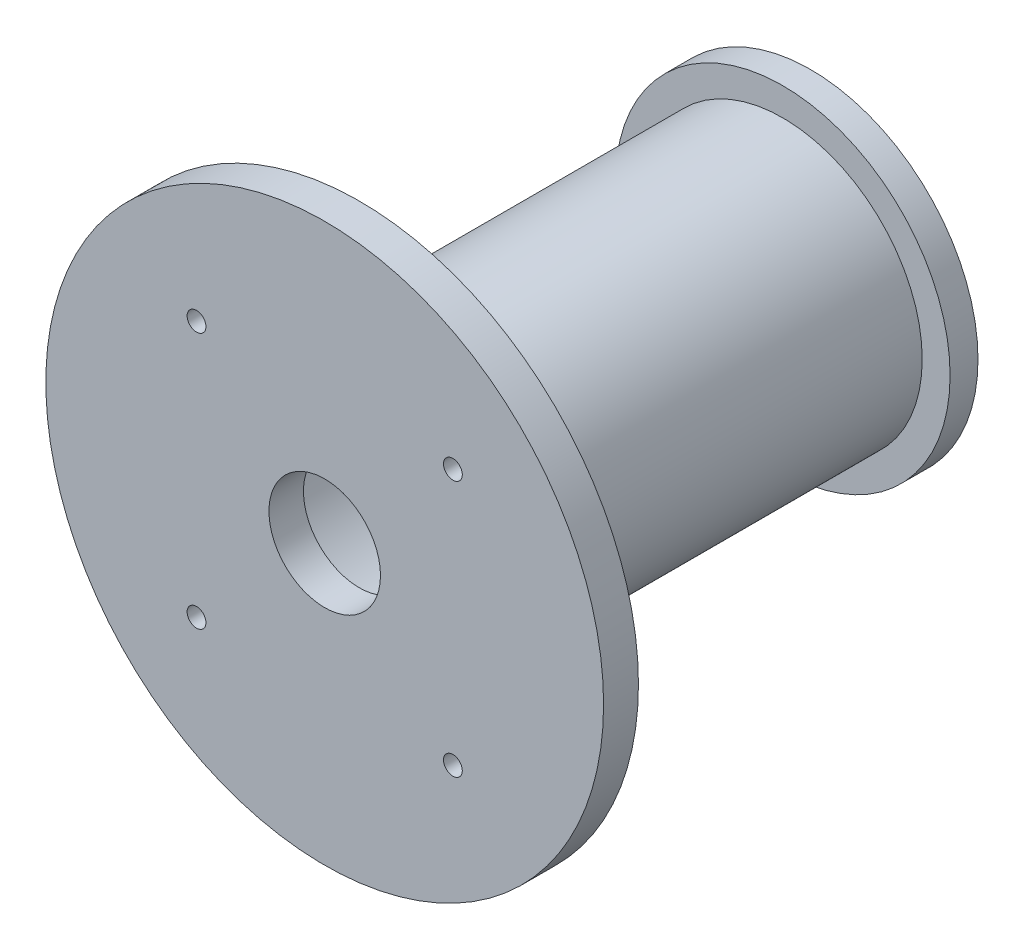
ISO-10303-21;
HEADER;
FILE_DESCRIPTION(('STEP AP214'),'2;1');
FILE_NAME('part.step','',(''),(''),'','','');
FILE_SCHEMA(('AUTOMOTIVE_DESIGN { 1 0 10303 214 1 1 1 1 }'));
ENDSEC;
DATA;
#1=APPLICATION_CONTEXT('core data for automotive mechanical design processes');
#2=APPLICATION_PROTOCOL_DEFINITION('international standard','automotive_design',2000,#1);
#3=PRODUCT_CONTEXT('',#1,'mechanical');
#4=PRODUCT('Part','Part','',(#3));
#5=PRODUCT_RELATED_PRODUCT_CATEGORY('part','',(#4));
#6=PRODUCT_DEFINITION_FORMATION('','',#4);
#7=PRODUCT_DEFINITION_CONTEXT('part definition',#1,'design');
#8=PRODUCT_DEFINITION('design','',#6,#7);
#9=PRODUCT_DEFINITION_SHAPE('','',#8);
#10=(LENGTH_UNIT() NAMED_UNIT(*) SI_UNIT(.MILLI.,.METRE.));
#11=(NAMED_UNIT(*) PLANE_ANGLE_UNIT() SI_UNIT($,.RADIAN.));
#12=(NAMED_UNIT(*) SI_UNIT($,.STERADIAN.) SOLID_ANGLE_UNIT());
#13=UNCERTAINTY_MEASURE_WITH_UNIT(LENGTH_MEASURE(1.E-05),#10,'distance_accuracy_value','');
#14=(GEOMETRIC_REPRESENTATION_CONTEXT(3) GLOBAL_UNCERTAINTY_ASSIGNED_CONTEXT((#13)) GLOBAL_UNIT_ASSIGNED_CONTEXT((#10,
#11,#12)) REPRESENTATION_CONTEXT('',''));
#15=CARTESIAN_POINT('',(0.,0.,0.));
#16=DIRECTION('',(0.,0.,1.));
#17=DIRECTION('',(1.,0.,0.));
#18=AXIS2_PLACEMENT_3D('',#15,#16,#17);
#19=CARTESIAN_POINT('',(120.,0.,131.7));
#20=DIRECTION('',(0.,0.,1.));
#21=DIRECTION('',(1.,0.,0.));
#22=AXIS2_PLACEMENT_3D('',#19,#20,#21);
#23=PLANE('',#22);
#24=CARTESIAN_POINT('',(138.38477631085,18.38477631085,131.7));
#25=DIRECTION('',(0.,0.,1.));
#26=DIRECTION('',(1.,0.,0.));
#27=AXIS2_PLACEMENT_3D('',#24,#25,#26);
#28=CIRCLE('',#27,1.35);
#29=CARTESIAN_POINT('',(139.73477631085,18.38477631085,131.7));
#30=VERTEX_POINT('',#29);
#31=EDGE_CURVE('E251',#30,#30,#28,.T.);
#32=ORIENTED_EDGE('',*,*,#31,.F.);
#33=EDGE_LOOP('',(#32));
#34=FACE_BOUND('',#33,.T.);
#35=CARTESIAN_POINT('',(101.61522368915,18.38477631085,131.7));
#36=DIRECTION('',(0.,0.,1.));
#37=DIRECTION('',(1.,0.,0.));
#38=AXIS2_PLACEMENT_3D('',#35,#36,#37);
#39=CIRCLE('',#38,1.35);
#40=CARTESIAN_POINT('',(102.96522368915,18.38477631085,131.7));
#41=VERTEX_POINT('',#40);
#42=EDGE_CURVE('E275',#41,#41,#39,.T.);
#43=ORIENTED_EDGE('',*,*,#42,.F.);
#44=EDGE_LOOP('',(#43));
#45=FACE_BOUND('',#44,.T.);
#46=CARTESIAN_POINT('',(120.,0.,131.7));
#47=DIRECTION('',(0.,0.,1.));
#48=DIRECTION('',(1.,0.,0.));
#49=AXIS2_PLACEMENT_3D('',#46,#47,#48);
#50=CIRCLE('',#49,8.);
#51=CARTESIAN_POINT('',(128.,0.,131.7));
#52=VERTEX_POINT('',#51);
#53=EDGE_CURVE('E9',#52,#52,#50,.T.);
#54=ORIENTED_EDGE('',*,*,#53,.F.);
#55=EDGE_LOOP('',(#54));
#56=FACE_BOUND('',#55,.T.);
#57=CARTESIAN_POINT('',(138.38477631085,-18.38477631085,131.7));
#58=DIRECTION('',(0.,0.,1.));
#59=DIRECTION('',(1.,0.,0.));
#60=AXIS2_PLACEMENT_3D('',#57,#58,#59);
#61=CIRCLE('',#60,1.35);
#62=CARTESIAN_POINT('',(139.73477631085,-18.38477631085,131.7));
#63=VERTEX_POINT('',#62);
#64=EDGE_CURVE('E276',#63,#63,#61,.T.);
#65=ORIENTED_EDGE('',*,*,#64,.F.);
#66=EDGE_LOOP('',(#65));
#67=FACE_BOUND('',#66,.T.);
#68=CARTESIAN_POINT('',(101.61522368915,-18.38477631085,131.7));
#69=DIRECTION('',(0.,0.,1.));
#70=DIRECTION('',(1.,0.,0.));
#71=AXIS2_PLACEMENT_3D('',#68,#69,#70);
#72=CIRCLE('',#71,1.35);
#73=CARTESIAN_POINT('',(102.96522368915,-18.38477631085,131.7));
#74=VERTEX_POINT('',#73);
#75=EDGE_CURVE('E249',#74,#74,#72,.T.);
#76=ORIENTED_EDGE('',*,*,#75,.F.);
#77=EDGE_LOOP('',(#76));
#78=FACE_BOUND('',#77,.T.);
#79=CARTESIAN_POINT('',(120.,0.,131.7));
#80=DIRECTION('',(0.,0.,1.));
#81=DIRECTION('',(1.,0.,0.));
#82=AXIS2_PLACEMENT_3D('',#79,#80,#81);
#83=CIRCLE('',#82,40.);
#84=CARTESIAN_POINT('',(160.,0.,131.7));
#85=VERTEX_POINT('',#84);
#86=EDGE_CURVE('E309',#85,#85,#83,.T.);
#87=ORIENTED_EDGE('',*,*,#86,.T.);
#88=EDGE_LOOP('',(#87));
#89=FACE_BOUND('',#88,.T.);
#90=ADVANCED_FACE('F14',(#34,#45,#56,#67,#78,#89),#23,.T.);
#91=CARTESIAN_POINT('',(120.,0.,126.6));
#92=DIRECTION('',(0.,0.,1.));
#93=DIRECTION('',(1.,0.,0.));
#94=AXIS2_PLACEMENT_3D('',#91,#92,#93);
#95=CYLINDRICAL_SURFACE('',#94,8.);
#96=DIRECTION('',(0.,0.,1.));
#97=VECTOR('',#96,1.);
#98=CARTESIAN_POINT('',(128.,0.,126.6));
#99=LINE('',#98,#97);
#100=CARTESIAN_POINT('',(128.,0.,126.75));
#101=VERTEX_POINT('',#100);
#102=EDGE_CURVE('E25',#101,#52,#99,.T.);
#103=ORIENTED_EDGE('',*,*,#102,.F.);
#104=CARTESIAN_POINT('',(120.,0.,126.75));
#105=DIRECTION('',(0.,0.,1.));
#106=DIRECTION('',(1.,0.,0.));
#107=AXIS2_PLACEMENT_3D('',#104,#105,#106);
#108=CIRCLE('',#107,8.);
#109=EDGE_CURVE('E314',#101,#101,#108,.T.);
#110=ORIENTED_EDGE('',*,*,#109,.F.);
#111=ORIENTED_EDGE('',*,*,#102,.T.);
#112=ORIENTED_EDGE('',*,*,#53,.T.);
#113=EDGE_LOOP('',(#103,#110,#111,#112));
#114=FACE_BOUND('',#113,.T.);
#115=ADVANCED_FACE('F537',(#114),#95,.F.);
#116=CARTESIAN_POINT('',(138.38477631085,18.38477631085,126.6));
#117=DIRECTION('',(0.,0.,1.));
#118=DIRECTION('',(1.,0.,0.));
#119=AXIS2_PLACEMENT_3D('',#116,#117,#118);
#120=CYLINDRICAL_SURFACE('',#119,1.35);
#121=DIRECTION('',(0.,0.,1.));
#122=VECTOR('',#121,1.);
#123=CARTESIAN_POINT('',(139.73477631085,18.38477631085,126.6));
#124=LINE('',#123,#122);
#125=CARTESIAN_POINT('',(139.73477631085,18.38477631085,126.7));
#126=VERTEX_POINT('',#125);
#127=EDGE_CURVE('E252',#126,#30,#124,.T.);
#128=ORIENTED_EDGE('',*,*,#127,.F.);
#129=CARTESIAN_POINT('',(138.38477631085,18.38477631085,126.7));
#130=DIRECTION('',(0.,0.,1.));
#131=DIRECTION('',(1.,0.,0.));
#132=AXIS2_PLACEMENT_3D('',#129,#130,#131);
#133=CIRCLE('',#132,1.35);
#134=EDGE_CURVE('E295',#126,#126,#133,.T.);
#135=ORIENTED_EDGE('',*,*,#134,.F.);
#136=ORIENTED_EDGE('',*,*,#127,.T.);
#137=ORIENTED_EDGE('',*,*,#31,.T.);
#138=EDGE_LOOP('',(#128,#135,#136,#137));
#139=FACE_BOUND('',#138,.T.);
#140=ADVANCED_FACE('F543',(#139),#120,.F.);
#141=CARTESIAN_POINT('',(101.61522368915,18.38477631085,126.6));
#142=DIRECTION('',(0.,0.,1.));
#143=DIRECTION('',(1.,0.,0.));
#144=AXIS2_PLACEMENT_3D('',#141,#142,#143);
#145=CYLINDRICAL_SURFACE('',#144,1.35);
#146=DIRECTION('',(0.,0.,1.));
#147=VECTOR('',#146,1.);
#148=CARTESIAN_POINT('',(102.96522368915,18.38477631085,126.6));
#149=LINE('',#148,#147);
#150=CARTESIAN_POINT('',(102.96522368915,18.38477631085,126.7));
#151=VERTEX_POINT('',#150);
#152=EDGE_CURVE('E271',#151,#41,#149,.T.);
#153=ORIENTED_EDGE('',*,*,#152,.F.);
#154=CARTESIAN_POINT('',(101.61522368915,18.38477631085,126.7));
#155=DIRECTION('',(0.,0.,1.));
#156=DIRECTION('',(1.,0.,0.));
#157=AXIS2_PLACEMENT_3D('',#154,#155,#156);
#158=CIRCLE('',#157,1.35);
#159=EDGE_CURVE('E270',#151,#151,#158,.T.);
#160=ORIENTED_EDGE('',*,*,#159,.F.);
#161=ORIENTED_EDGE('',*,*,#152,.T.);
#162=ORIENTED_EDGE('',*,*,#42,.T.);
#163=EDGE_LOOP('',(#153,#160,#161,#162));
#164=FACE_BOUND('',#163,.T.);
#165=ADVANCED_FACE('F564',(#164),#145,.F.);
#166=CARTESIAN_POINT('',(138.38477631085,-18.38477631085,126.6));
#167=DIRECTION('',(0.,0.,1.));
#168=DIRECTION('',(1.,0.,0.));
#169=AXIS2_PLACEMENT_3D('',#166,#167,#168);
#170=CYLINDRICAL_SURFACE('',#169,1.35);
#171=DIRECTION('',(0.,0.,1.));
#172=VECTOR('',#171,1.);
#173=CARTESIAN_POINT('',(139.73477631085,-18.38477631085,126.6));
#174=LINE('',#173,#172);
#175=CARTESIAN_POINT('',(139.73477631085,-18.38477631085,126.7));
#176=VERTEX_POINT('',#175);
#177=EDGE_CURVE('E411',#176,#63,#174,.T.);
#178=ORIENTED_EDGE('',*,*,#177,.F.);
#179=CARTESIAN_POINT('',(138.38477631085,-18.38477631085,126.7));
#180=DIRECTION('',(0.,0.,1.));
#181=DIRECTION('',(1.,0.,0.));
#182=AXIS2_PLACEMENT_3D('',#179,#180,#181);
#183=CIRCLE('',#182,1.35);
#184=EDGE_CURVE('E266',#176,#176,#183,.T.);
#185=ORIENTED_EDGE('',*,*,#184,.F.);
#186=ORIENTED_EDGE('',*,*,#177,.T.);
#187=ORIENTED_EDGE('',*,*,#64,.T.);
#188=EDGE_LOOP('',(#178,#185,#186,#187));
#189=FACE_BOUND('',#188,.T.);
#190=ADVANCED_FACE('F560',(#189),#170,.F.);
#191=CARTESIAN_POINT('',(101.61522368915,-18.38477631085,126.6));
#192=DIRECTION('',(0.,0.,1.));
#193=DIRECTION('',(1.,0.,0.));
#194=AXIS2_PLACEMENT_3D('',#191,#192,#193);
#195=CYLINDRICAL_SURFACE('',#194,1.35);
#196=DIRECTION('',(0.,0.,1.));
#197=VECTOR('',#196,1.);
#198=CARTESIAN_POINT('',(102.96522368915,-18.38477631085,126.6));
#199=LINE('',#198,#197);
#200=CARTESIAN_POINT('',(102.96522368915,-18.38477631085,126.7));
#201=VERTEX_POINT('',#200);
#202=EDGE_CURVE('E320',#201,#74,#199,.T.);
#203=ORIENTED_EDGE('',*,*,#202,.F.);
#204=CARTESIAN_POINT('',(101.61522368915,-18.38477631085,126.7));
#205=DIRECTION('',(0.,0.,1.));
#206=DIRECTION('',(1.,0.,0.));
#207=AXIS2_PLACEMENT_3D('',#204,#205,#206);
#208=CIRCLE('',#207,1.35);
#209=EDGE_CURVE('E264',#201,#201,#208,.T.);
#210=ORIENTED_EDGE('',*,*,#209,.F.);
#211=ORIENTED_EDGE('',*,*,#202,.T.);
#212=ORIENTED_EDGE('',*,*,#75,.T.);
#213=EDGE_LOOP('',(#203,#210,#211,#212));
#214=FACE_BOUND('',#213,.T.);
#215=ADVANCED_FACE('F563',(#214),#195,.F.);
#216=CARTESIAN_POINT('',(120.,0.,126.7));
#217=DIRECTION('',(0.,0.,1.));
#218=DIRECTION('',(1.,0.,0.));
#219=AXIS2_PLACEMENT_3D('',#216,#217,#218);
#220=CYLINDRICAL_SURFACE('',#219,40.);
#221=ORIENTED_EDGE('',*,*,#86,.F.);
#222=DIRECTION('',(0.,0.,1.));
#223=VECTOR('',#222,1.);
#224=CARTESIAN_POINT('',(160.,0.,126.7));
#225=LINE('',#224,#223);
#226=CARTESIAN_POINT('',(160.,0.,126.7));
#227=VERTEX_POINT('',#226);
#228=EDGE_CURVE('E313',#227,#85,#225,.T.);
#229=ORIENTED_EDGE('',*,*,#228,.F.);
#230=CARTESIAN_POINT('',(120.,0.,126.7));
#231=DIRECTION('',(0.,0.,1.));
#232=DIRECTION('',(1.,0.,0.));
#233=AXIS2_PLACEMENT_3D('',#230,#231,#232);
#234=CIRCLE('',#233,40.);
#235=EDGE_CURVE('E260',#227,#227,#234,.T.);
#236=ORIENTED_EDGE('',*,*,#235,.T.);
#237=ORIENTED_EDGE('',*,*,#228,.T.);
#238=EDGE_LOOP('',(#221,#229,#236,#237));
#239=FACE_BOUND('',#238,.T.);
#240=ADVANCED_FACE('F549',(#239),#220,.T.);
#241=CARTESIAN_POINT('',(104.,-6.,101.7));
#242=DIRECTION('',(1.,0.,0.));
#243=DIRECTION('',(0.,1.,0.));
#244=AXIS2_PLACEMENT_3D('',#241,#242,#243);
#245=PLANE('',#244);
#246=DIRECTION('',(0.,0.,1.));
#247=VECTOR('',#246,1.);
#248=CARTESIAN_POINT('',(104.,6.,101.7));
#249=LINE('',#248,#247);
#250=CARTESIAN_POINT('',(104.,6.,101.7));
#251=VERTEX_POINT('',#250);
#252=CARTESIAN_POINT('',(104.,6.,126.7));
#253=VERTEX_POINT('',#252);
#254=EDGE_CURVE('E223',#251,#253,#249,.T.);
#255=ORIENTED_EDGE('',*,*,#254,.F.);
#256=DIRECTION('',(0.,1.,0.));
#257=VECTOR('',#256,1.);
#258=CARTESIAN_POINT('',(104.,-6.,101.7));
#259=LINE('',#258,#257);
#260=CARTESIAN_POINT('',(104.,5.744562646538,101.7));
#261=VERTEX_POINT('',#260);
#262=EDGE_CURVE('E218',#261,#251,#259,.T.);
#263=ORIENTED_EDGE('',*,*,#262,.F.);
#264=DIRECTION('',(0.,0.,1.));
#265=VECTOR('',#264,1.);
#266=CARTESIAN_POINT('',(104.,5.744562646538,61.95));
#267=LINE('',#266,#265);
#268=CARTESIAN_POINT('',(104.,5.744562646538,126.7));
#269=VERTEX_POINT('',#268);
#270=EDGE_CURVE('E281',#261,#269,#267,.T.);
#271=ORIENTED_EDGE('',*,*,#270,.T.);
#272=DIRECTION('',(0.,1.,0.));
#273=VECTOR('',#272,1.);
#274=CARTESIAN_POINT('',(104.,-6.,126.7));
#275=LINE('',#274,#273);
#276=EDGE_CURVE('E308',#269,#253,#275,.T.);
#277=ORIENTED_EDGE('',*,*,#276,.T.);
#278=EDGE_LOOP('',(#255,#263,#271,#277));
#279=FACE_BOUND('',#278,.T.);
#280=ADVANCED_FACE('F474',(#279),#245,.F.);
#281=CARTESIAN_POINT('',(104.,-6.,101.7));
#282=DIRECTION('',(1.,0.,0.));
#283=DIRECTION('',(0.,1.,0.));
#284=AXIS2_PLACEMENT_3D('',#281,#282,#283);
#285=PLANE('',#284);
#286=DIRECTION('',(0.,0.,1.));
#287=VECTOR('',#286,1.);
#288=CARTESIAN_POINT('',(104.,-5.744562646538,61.95));
#289=LINE('',#288,#287);
#290=CARTESIAN_POINT('',(104.,-5.744562646538,101.7));
#291=VERTEX_POINT('',#290);
#292=CARTESIAN_POINT('',(104.,-5.744562646538,126.7));
#293=VERTEX_POINT('',#292);
#294=EDGE_CURVE('E420',#291,#293,#289,.T.);
#295=ORIENTED_EDGE('',*,*,#294,.F.);
#296=DIRECTION('',(0.,1.,0.));
#297=VECTOR('',#296,1.);
#298=CARTESIAN_POINT('',(104.,-6.,101.7));
#299=LINE('',#298,#297);
#300=CARTESIAN_POINT('',(104.,-6.,101.7));
#301=VERTEX_POINT('',#300);
#302=EDGE_CURVE('E406',#301,#291,#299,.T.);
#303=ORIENTED_EDGE('',*,*,#302,.F.);
#304=DIRECTION('',(0.,0.,1.));
#305=VECTOR('',#304,1.);
#306=CARTESIAN_POINT('',(104.,-6.,101.7));
#307=LINE('',#306,#305);
#308=CARTESIAN_POINT('',(104.,-6.,126.7));
#309=VERTEX_POINT('',#308);
#310=EDGE_CURVE('E318',#301,#309,#307,.T.);
#311=ORIENTED_EDGE('',*,*,#310,.T.);
#312=DIRECTION('',(0.,1.,0.));
#313=VECTOR('',#312,1.);
#314=CARTESIAN_POINT('',(104.,-6.,126.7));
#315=LINE('',#314,#313);
#316=EDGE_CURVE('E366',#309,#293,#315,.T.);
#317=ORIENTED_EDGE('',*,*,#316,.T.);
#318=EDGE_LOOP('',(#295,#303,#311,#317));
#319=FACE_BOUND('',#318,.T.);
#320=ADVANCED_FACE('F461',(#319),#285,.F.);
#321=CARTESIAN_POINT('',(107.97918471982,12.020815280171,66.1));
#322=DIRECTION('',(0.,0.,1.));
#323=DIRECTION('',(1.,0.,0.));
#324=AXIS2_PLACEMENT_3D('',#321,#322,#323);
#325=PLANE('',#324);
#326=CARTESIAN_POINT('',(107.97918471982,12.020815280171,66.1));
#327=DIRECTION('',(0.,0.,1.));
#328=DIRECTION('',(1.,0.,0.));
#329=AXIS2_PLACEMENT_3D('',#326,#327,#328);
#330=CIRCLE('',#329,1.7);
#331=CARTESIAN_POINT('',(109.23986678203,13.161289189576,66.1));
#332=VERTEX_POINT('',#331);
#333=CARTESIAN_POINT('',(106.83871081042,10.760133217965,66.1));
#334=VERTEX_POINT('',#333);
#335=EDGE_CURVE('E373',#332,#334,#330,.T.);
#336=ORIENTED_EDGE('',*,*,#335,.F.);
#337=CARTESIAN_POINT('',(120.,0.,66.1));
#338=DIRECTION('',(0.,0.,1.));
#339=DIRECTION('',(1.,0.,0.));
#340=AXIS2_PLACEMENT_3D('',#337,#338,#339);
#341=CIRCLE('',#340,17.);
#342=EDGE_CURVE('E358',#332,#334,#341,.T.);
#343=ORIENTED_EDGE('',*,*,#342,.T.);
#344=EDGE_LOOP('',(#336,#343));
#345=FACE_BOUND('',#344,.T.);
#346=ADVANCED_FACE('F572',(#345),#325,.F.);
#347=CARTESIAN_POINT('',(107.97918471982,-12.02081528017,66.1));
#348=DIRECTION('',(0.,0.,1.));
#349=DIRECTION('',(1.,0.,0.));
#350=AXIS2_PLACEMENT_3D('',#347,#348,#349);
#351=PLANE('',#350);
#352=CARTESIAN_POINT('',(107.97918471982,-12.02081528017,66.1));
#353=DIRECTION('',(0.,0.,1.));
#354=DIRECTION('',(1.,0.,0.));
#355=AXIS2_PLACEMENT_3D('',#352,#353,#354);
#356=CIRCLE('',#355,1.7);
#357=CARTESIAN_POINT('',(106.83871081042,-10.76013321796,66.1));
#358=VERTEX_POINT('',#357);
#359=CARTESIAN_POINT('',(109.23986678203,-13.16128918957,66.1));
#360=VERTEX_POINT('',#359);
#361=EDGE_CURVE('E376',#358,#360,#356,.T.);
#362=ORIENTED_EDGE('',*,*,#361,.F.);
#363=CARTESIAN_POINT('',(120.,0.,66.1));
#364=DIRECTION('',(0.,0.,1.));
#365=DIRECTION('',(1.,0.,0.));
#366=AXIS2_PLACEMENT_3D('',#363,#364,#365);
#367=CIRCLE('',#366,17.);
#368=EDGE_CURVE('E381',#358,#360,#367,.T.);
#369=ORIENTED_EDGE('',*,*,#368,.T.);
#370=EDGE_LOOP('',(#362,#369));
#371=FACE_BOUND('',#370,.T.);
#372=ADVANCED_FACE('F553',(#371),#351,.F.);
#373=CARTESIAN_POINT('',(132.02081528017,-12.02081528017,66.1));
#374=DIRECTION('',(0.,0.,1.));
#375=DIRECTION('',(1.,0.,0.));
#376=AXIS2_PLACEMENT_3D('',#373,#374,#375);
#377=PLANE('',#376);
#378=CARTESIAN_POINT('',(120.,0.,66.1));
#379=DIRECTION('',(0.,0.,1.));
#380=DIRECTION('',(1.,0.,0.));
#381=AXIS2_PLACEMENT_3D('',#378,#379,#380);
#382=CIRCLE('',#381,17.);
#383=CARTESIAN_POINT('',(130.76013321796,-13.16128918957,66.1));
#384=VERTEX_POINT('',#383);
#385=CARTESIAN_POINT('',(133.16128918957,-10.76013321796,66.1));
#386=VERTEX_POINT('',#385);
#387=EDGE_CURVE('E258',#384,#386,#382,.T.);
#388=ORIENTED_EDGE('',*,*,#387,.T.);
#389=CARTESIAN_POINT('',(132.02081528017,-12.02081528017,66.1));
#390=DIRECTION('',(0.,0.,1.));
#391=DIRECTION('',(-0.741577683650757,-0.67086700553178,0.));
#392=AXIS2_PLACEMENT_3D('',#389,#390,#391);
#393=CIRCLE('',#392,1.7);
#394=EDGE_CURVE('E384',#384,#386,#393,.T.);
#395=ORIENTED_EDGE('',*,*,#394,.F.);
#396=EDGE_LOOP('',(#388,#395));
#397=FACE_BOUND('',#396,.T.);
#398=ADVANCED_FACE('F507',(#397),#377,.F.);
#399=CARTESIAN_POINT('',(120.,0.,126.75));
#400=DIRECTION('',(0.,0.,1.));
#401=DIRECTION('',(1.,0.,0.));
#402=AXIS2_PLACEMENT_3D('',#399,#400,#401);
#403=PLANE('',#402);
#404=ORIENTED_EDGE('',*,*,#109,.T.);
#405=EDGE_LOOP('',(#404));
#406=FACE_BOUND('',#405,.T.);
#407=CARTESIAN_POINT('',(120.,0.,126.75));
#408=DIRECTION('',(0.,0.,1.));
#409=DIRECTION('',(1.,0.,0.));
#410=AXIS2_PLACEMENT_3D('',#407,#408,#409);
#411=CIRCLE('',#410,17.);
#412=CARTESIAN_POINT('',(137.,0.,126.75));
#413=VERTEX_POINT('',#412);
#414=EDGE_CURVE('E259',#413,#413,#411,.T.);
#415=ORIENTED_EDGE('',*,*,#414,.F.);
#416=EDGE_LOOP('',(#415));
#417=FACE_BOUND('',#416,.T.);
#418=ADVANCED_FACE('F527',(#406,#417),#403,.F.);
#419=CARTESIAN_POINT('',(132.02081528017,12.020815280171,66.1));
#420=DIRECTION('',(0.,0.,1.));
#421=DIRECTION('',(1.,0.,0.));
#422=AXIS2_PLACEMENT_3D('',#419,#420,#421);
#423=PLANE('',#422);
#424=CARTESIAN_POINT('',(120.,0.,66.1));
#425=DIRECTION('',(0.,0.,1.));
#426=DIRECTION('',(1.,0.,0.));
#427=AXIS2_PLACEMENT_3D('',#424,#425,#426);
#428=CIRCLE('',#427,17.);
#429=CARTESIAN_POINT('',(133.16128918957,10.760133217965,66.1));
#430=VERTEX_POINT('',#429);
#431=CARTESIAN_POINT('',(130.76013321796,13.161289189576,66.1));
#432=VERTEX_POINT('',#431);
#433=EDGE_CURVE('E337',#430,#432,#428,.T.);
#434=ORIENTED_EDGE('',*,*,#433,.T.);
#435=CARTESIAN_POINT('',(132.02081528017,12.020815280171,66.1));
#436=DIRECTION('',(0.,0.,1.));
#437=DIRECTION('',(0.67086700553178,-0.741577683650757,0.));
#438=AXIS2_PLACEMENT_3D('',#435,#436,#437);
#439=CIRCLE('',#438,1.7);
#440=EDGE_CURVE('E265',#430,#432,#439,.T.);
#441=ORIENTED_EDGE('',*,*,#440,.F.);
#442=EDGE_LOOP('',(#434,#441));
#443=FACE_BOUND('',#442,.T.);
#444=ADVANCED_FACE('F16',(#443),#423,.F.);
#445=CARTESIAN_POINT('',(99.,-6.,101.7));
#446=DIRECTION('',(0.,1.,0.));
#447=DIRECTION('',(1.,0.,0.));
#448=AXIS2_PLACEMENT_3D('',#445,#446,#447);
#449=PLANE('',#448);
#450=DIRECTION('',(1.,0.,0.));
#451=VECTOR('',#450,1.);
#452=CARTESIAN_POINT('',(99.,-6.,101.7));
#453=LINE('',#452,#451);
#454=CARTESIAN_POINT('',(100.92121597166,-6.,101.7));
#455=VERTEX_POINT('',#454);
#456=EDGE_CURVE('E222',#455,#301,#453,.T.);
#457=ORIENTED_EDGE('',*,*,#456,.F.);
#458=DIRECTION('',(0.,0.,1.));
#459=VECTOR('',#458,1.);
#460=CARTESIAN_POINT('',(100.92121597166,-6.,62.));
#461=LINE('',#460,#459);
#462=CARTESIAN_POINT('',(100.92121597166,-6.,126.7));
#463=VERTEX_POINT('',#462);
#464=EDGE_CURVE('E238',#455,#463,#461,.T.);
#465=ORIENTED_EDGE('',*,*,#464,.T.);
#466=DIRECTION('',(1.,0.,0.));
#467=VECTOR('',#466,1.);
#468=CARTESIAN_POINT('',(99.,-6.,126.7));
#469=LINE('',#468,#467);
#470=EDGE_CURVE('E299',#463,#309,#469,.T.);
#471=ORIENTED_EDGE('',*,*,#470,.T.);
#472=ORIENTED_EDGE('',*,*,#310,.F.);
#473=EDGE_LOOP('',(#457,#465,#471,#472));
#474=FACE_BOUND('',#473,.T.);
#475=ADVANCED_FACE('F464',(#474),#449,.T.);
#476=CARTESIAN_POINT('',(99.,-6.,101.7));
#477=DIRECTION('',(0.,0.,1.));
#478=DIRECTION('',(1.,0.,0.));
#479=AXIS2_PLACEMENT_3D('',#476,#477,#478);
#480=PLANE('',#479);
#481=DIRECTION('',(1.,0.,0.));
#482=VECTOR('',#481,1.);
#483=CARTESIAN_POINT('',(99.,6.,101.7));
#484=LINE('',#483,#482);
#485=CARTESIAN_POINT('',(100.92121597166,6.,101.7));
#486=VERTEX_POINT('',#485);
#487=EDGE_CURVE('E210',#486,#251,#484,.T.);
#488=ORIENTED_EDGE('',*,*,#487,.F.);
#489=CARTESIAN_POINT('',(120.,0.,101.7));
#490=DIRECTION('',(0.,0.,1.));
#491=DIRECTION('',(1.,0.,0.));
#492=AXIS2_PLACEMENT_3D('',#489,#490,#491);
#493=CIRCLE('',#492,20.);
#494=EDGE_CURVE('E215',#486,#455,#493,.T.);
#495=ORIENTED_EDGE('',*,*,#494,.T.);
#496=ORIENTED_EDGE('',*,*,#456,.T.);
#497=ORIENTED_EDGE('',*,*,#302,.T.);
#498=CARTESIAN_POINT('',(120.,0.,101.7));
#499=DIRECTION('',(0.,0.,1.));
#500=DIRECTION('',(1.,0.,0.));
#501=AXIS2_PLACEMENT_3D('',#498,#499,#500);
#502=CIRCLE('',#501,17.);
#503=EDGE_CURVE('E393',#261,#291,#502,.T.);
#504=ORIENTED_EDGE('',*,*,#503,.F.);
#505=ORIENTED_EDGE('',*,*,#262,.T.);
#506=EDGE_LOOP('',(#488,#495,#496,#497,#504,#505));
#507=FACE_BOUND('',#506,.T.);
#508=ADVANCED_FACE('F212',(#507),#480,.T.);
#509=CARTESIAN_POINT('',(99.,6.,101.7));
#510=DIRECTION('',(0.,1.,0.));
#511=DIRECTION('',(1.,0.,0.));
#512=AXIS2_PLACEMENT_3D('',#509,#510,#511);
#513=PLANE('',#512);
#514=ORIENTED_EDGE('',*,*,#254,.T.);
#515=DIRECTION('',(1.,0.,0.));
#516=VECTOR('',#515,1.);
#517=CARTESIAN_POINT('',(99.,6.,126.7));
#518=LINE('',#517,#516);
#519=CARTESIAN_POINT('',(100.92121597166,6.,126.7));
#520=VERTEX_POINT('',#519);
#521=EDGE_CURVE('E229',#520,#253,#518,.T.);
#522=ORIENTED_EDGE('',*,*,#521,.F.);
#523=DIRECTION('',(0.,0.,1.));
#524=VECTOR('',#523,1.);
#525=CARTESIAN_POINT('',(100.92121597166,6.,62.));
#526=LINE('',#525,#524);
#527=EDGE_CURVE('E226',#486,#520,#526,.T.);
#528=ORIENTED_EDGE('',*,*,#527,.F.);
#529=ORIENTED_EDGE('',*,*,#487,.T.);
#530=EDGE_LOOP('',(#514,#522,#528,#529));
#531=FACE_BOUND('',#530,.T.);
#532=ADVANCED_FACE('F227',(#531),#513,.F.);
#533=CARTESIAN_POINT('',(120.,0.,126.7));
#534=DIRECTION('',(0.,0.,1.));
#535=DIRECTION('',(1.,0.,0.));
#536=AXIS2_PLACEMENT_3D('',#533,#534,#535);
#537=PLANE('',#536);
#538=ORIENTED_EDGE('',*,*,#134,.T.);
#539=EDGE_LOOP('',(#538));
#540=FACE_BOUND('',#539,.T.);
#541=ORIENTED_EDGE('',*,*,#521,.T.);
#542=ORIENTED_EDGE('',*,*,#276,.F.);
#543=CARTESIAN_POINT('',(120.,0.,126.7));
#544=DIRECTION('',(0.,0.,1.));
#545=DIRECTION('',(1.,0.,0.));
#546=AXIS2_PLACEMENT_3D('',#543,#544,#545);
#547=CIRCLE('',#546,17.);
#548=EDGE_CURVE('E277',#269,#293,#547,.T.);
#549=ORIENTED_EDGE('',*,*,#548,.T.);
#550=ORIENTED_EDGE('',*,*,#316,.F.);
#551=ORIENTED_EDGE('',*,*,#470,.F.);
#552=CARTESIAN_POINT('',(120.,0.,126.7));
#553=DIRECTION('',(0.,0.,1.));
#554=DIRECTION('',(1.,0.,0.));
#555=AXIS2_PLACEMENT_3D('',#552,#553,#554);
#556=CIRCLE('',#555,20.);
#557=CARTESIAN_POINT('',(140.,0.,126.7));
#558=VERTEX_POINT('',#557);
#559=EDGE_CURVE('E245',#463,#558,#556,.T.);
#560=ORIENTED_EDGE('',*,*,#559,.T.);
#561=CARTESIAN_POINT('',(120.,0.,126.7));
#562=DIRECTION('',(0.,0.,1.));
#563=DIRECTION('',(1.,0.,0.));
#564=AXIS2_PLACEMENT_3D('',#561,#562,#563);
#565=CIRCLE('',#564,20.);
#566=EDGE_CURVE('E233',#558,#520,#565,.T.);
#567=ORIENTED_EDGE('',*,*,#566,.T.);
#568=EDGE_LOOP('',(#541,#542,#549,#550,#551,#560,#567));
#569=FACE_BOUND('',#568,.T.);
#570=ORIENTED_EDGE('',*,*,#159,.T.);
#571=EDGE_LOOP('',(#570));
#572=FACE_BOUND('',#571,.T.);
#573=ORIENTED_EDGE('',*,*,#184,.T.);
#574=EDGE_LOOP('',(#573));
#575=FACE_BOUND('',#574,.T.);
#576=ORIENTED_EDGE('',*,*,#209,.T.);
#577=EDGE_LOOP('',(#576));
#578=FACE_BOUND('',#577,.T.);
#579=ORIENTED_EDGE('',*,*,#235,.F.);
#580=EDGE_LOOP('',(#579));
#581=FACE_BOUND('',#580,.T.);
#582=ADVANCED_FACE('F465',(#540,#569,#572,#575,#578,#581),#537,.F.);
#583=CARTESIAN_POINT('',(132.02081528017,12.020815280171,61.9));
#584=DIRECTION('',(0.,0.,1.));
#585=DIRECTION('',(1.,0.,0.));
#586=AXIS2_PLACEMENT_3D('',#583,#584,#585);
#587=CYLINDRICAL_SURFACE('',#586,1.7);
#588=DIRECTION('',(0.,0.,1.));
#589=VECTOR('',#588,1.);
#590=CARTESIAN_POINT('',(133.16128918957,10.760133217965,61.95));
#591=LINE('',#590,#589);
#592=CARTESIAN_POINT('',(133.16128918957,10.760133217965,62.));
#593=VERTEX_POINT('',#592);
#594=EDGE_CURVE('E341',#593,#430,#591,.T.);
#595=ORIENTED_EDGE('',*,*,#594,.T.);
#596=ORIENTED_EDGE('',*,*,#440,.T.);
#597=DIRECTION('',(0.,0.,1.));
#598=VECTOR('',#597,1.);
#599=CARTESIAN_POINT('',(130.76013321796,13.161289189576,61.95));
#600=LINE('',#599,#598);
#601=CARTESIAN_POINT('',(130.76013321796,13.161289189576,62.));
#602=VERTEX_POINT('',#601);
#603=EDGE_CURVE('E282',#602,#432,#600,.T.);
#604=ORIENTED_EDGE('',*,*,#603,.F.);
#605=CARTESIAN_POINT('',(132.02081528017,12.020815280171,62.));
#606=DIRECTION('',(0.,0.,1.));
#607=DIRECTION('',(0.67086700553178,-0.741577683650757,0.));
#608=AXIS2_PLACEMENT_3D('',#605,#606,#607);
#609=CIRCLE('',#608,1.7);
#610=EDGE_CURVE('E293',#593,#602,#609,.T.);
#611=ORIENTED_EDGE('',*,*,#610,.F.);
#612=EDGE_LOOP('',(#595,#596,#604,#611));
#613=FACE_BOUND('',#612,.T.);
#614=ADVANCED_FACE('F522',(#613),#587,.F.);
#615=CARTESIAN_POINT('',(107.97918471982,12.020815280171,61.9));
#616=DIRECTION('',(0.,0.,1.));
#617=DIRECTION('',(1.,0.,0.));
#618=AXIS2_PLACEMENT_3D('',#615,#616,#617);
#619=CYLINDRICAL_SURFACE('',#618,1.7);
#620=DIRECTION('',(0.,0.,1.));
#621=VECTOR('',#620,1.);
#622=CARTESIAN_POINT('',(106.83871081042,10.760133217965,61.95));
#623=LINE('',#622,#621);
#624=CARTESIAN_POINT('',(106.83871081042,10.760133217965,62.));
#625=VERTEX_POINT('',#624);
#626=EDGE_CURVE('E363',#625,#334,#623,.T.);
#627=ORIENTED_EDGE('',*,*,#626,.F.);
#628=CARTESIAN_POINT('',(107.97918471982,12.020815280171,62.));
#629=DIRECTION('',(0.,0.,1.));
#630=DIRECTION('',(1.,0.,0.));
#631=AXIS2_PLACEMENT_3D('',#628,#629,#630);
#632=CIRCLE('',#631,1.7);
#633=CARTESIAN_POINT('',(109.23986678203,13.161289189576,62.));
#634=VERTEX_POINT('',#633);
#635=EDGE_CURVE('E345',#634,#625,#632,.T.);
#636=ORIENTED_EDGE('',*,*,#635,.F.);
#637=DIRECTION('',(0.,0.,1.));
#638=VECTOR('',#637,1.);
#639=CARTESIAN_POINT('',(109.23986678203,13.161289189576,61.95));
#640=LINE('',#639,#638);
#641=EDGE_CURVE('E362',#634,#332,#640,.T.);
#642=ORIENTED_EDGE('',*,*,#641,.T.);
#643=ORIENTED_EDGE('',*,*,#335,.T.);
#644=EDGE_LOOP('',(#627,#636,#642,#643));
#645=FACE_BOUND('',#644,.T.);
#646=ADVANCED_FACE('F570',(#645),#619,.F.);
#647=CARTESIAN_POINT('',(107.97918471982,-12.02081528017,61.9));
#648=DIRECTION('',(0.,0.,1.));
#649=DIRECTION('',(1.,0.,0.));
#650=AXIS2_PLACEMENT_3D('',#647,#648,#649);
#651=CYLINDRICAL_SURFACE('',#650,1.7);
#652=DIRECTION('',(0.,0.,1.));
#653=VECTOR('',#652,1.);
#654=CARTESIAN_POINT('',(109.23986678203,-13.16128918957,61.95));
#655=LINE('',#654,#653);
#656=CARTESIAN_POINT('',(109.23986678203,-13.16128918957,62.));
#657=VERTEX_POINT('',#656);
#658=EDGE_CURVE('E377',#657,#360,#655,.T.);
#659=ORIENTED_EDGE('',*,*,#658,.F.);
#660=CARTESIAN_POINT('',(107.97918471982,-12.02081528017,62.));
#661=DIRECTION('',(0.,0.,1.));
#662=DIRECTION('',(1.,0.,0.));
#663=AXIS2_PLACEMENT_3D('',#660,#661,#662);
#664=CIRCLE('',#663,1.7);
#665=CARTESIAN_POINT('',(106.83871081042,-10.76013321796,62.));
#666=VERTEX_POINT('',#665);
#667=EDGE_CURVE('E300',#666,#657,#664,.T.);
#668=ORIENTED_EDGE('',*,*,#667,.F.);
#669=DIRECTION('',(0.,0.,1.));
#670=VECTOR('',#669,1.);
#671=CARTESIAN_POINT('',(106.83871081042,-10.76013321796,61.95));
#672=LINE('',#671,#670);
#673=EDGE_CURVE('E405',#666,#358,#672,.T.);
#674=ORIENTED_EDGE('',*,*,#673,.T.);
#675=ORIENTED_EDGE('',*,*,#361,.T.);
#676=EDGE_LOOP('',(#659,#668,#674,#675));
#677=FACE_BOUND('',#676,.T.);
#678=ADVANCED_FACE('F578',(#677),#651,.F.);
#679=CARTESIAN_POINT('',(132.02081528017,-12.02081528017,61.9));
#680=DIRECTION('',(0.,0.,1.));
#681=DIRECTION('',(1.,0.,0.));
#682=AXIS2_PLACEMENT_3D('',#679,#680,#681);
#683=CYLINDRICAL_SURFACE('',#682,1.7);
#684=DIRECTION('',(0.,0.,1.));
#685=VECTOR('',#684,1.);
#686=CARTESIAN_POINT('',(130.76013321796,-13.16128918957,61.95));
#687=LINE('',#686,#685);
#688=CARTESIAN_POINT('',(130.76013321796,-13.16128918957,62.));
#689=VERTEX_POINT('',#688);
#690=EDGE_CURVE('E357',#689,#384,#687,.T.);
#691=ORIENTED_EDGE('',*,*,#690,.T.);
#692=ORIENTED_EDGE('',*,*,#394,.T.);
#693=DIRECTION('',(0.,0.,1.));
#694=VECTOR('',#693,1.);
#695=CARTESIAN_POINT('',(133.16128918957,-10.76013321796,61.95));
#696=LINE('',#695,#694);
#697=CARTESIAN_POINT('',(133.16128918957,-10.76013321796,62.));
#698=VERTEX_POINT('',#697);
#699=EDGE_CURVE('E254',#698,#386,#696,.T.);
#700=ORIENTED_EDGE('',*,*,#699,.F.);
#701=CARTESIAN_POINT('',(132.02081528017,-12.02081528017,62.));
#702=DIRECTION('',(0.,0.,1.));
#703=DIRECTION('',(-0.741577683650757,-0.67086700553178,0.));
#704=AXIS2_PLACEMENT_3D('',#701,#702,#703);
#705=CIRCLE('',#704,1.7);
#706=EDGE_CURVE('E435',#689,#698,#705,.T.);
#707=ORIENTED_EDGE('',*,*,#706,.F.);
#708=EDGE_LOOP('',(#691,#692,#700,#707));
#709=FACE_BOUND('',#708,.T.);
#710=ADVANCED_FACE('F501',(#709),#683,.F.);
#711=CARTESIAN_POINT('',(120.,0.,61.95));
#712=DIRECTION('',(0.,0.,1.));
#713=DIRECTION('',(1.,0.,0.));
#714=AXIS2_PLACEMENT_3D('',#711,#712,#713);
#715=CYLINDRICAL_SURFACE('',#714,17.);
#716=ORIENTED_EDGE('',*,*,#548,.F.);
#717=ORIENTED_EDGE('',*,*,#270,.F.);
#718=ORIENTED_EDGE('',*,*,#503,.T.);
#719=ORIENTED_EDGE('',*,*,#294,.T.);
#720=EDGE_LOOP('',(#716,#717,#718,#719));
#721=FACE_BOUND('',#720,.T.);
#722=ORIENTED_EDGE('',*,*,#433,.F.);
#723=ORIENTED_EDGE('',*,*,#594,.F.);
#724=CARTESIAN_POINT('',(120.,0.,62.));
#725=DIRECTION('',(0.,0.,1.));
#726=DIRECTION('',(1.,0.,0.));
#727=AXIS2_PLACEMENT_3D('',#724,#725,#726);
#728=CIRCLE('',#727,17.);
#729=CARTESIAN_POINT('',(137.,0.,62.));
#730=VERTEX_POINT('',#729);
#731=EDGE_CURVE('E283',#730,#593,#728,.T.);
#732=ORIENTED_EDGE('',*,*,#731,.F.);
#733=DIRECTION('',(0.,0.,1.));
#734=VECTOR('',#733,1.);
#735=CARTESIAN_POINT('',(137.,0.,61.95));
#736=LINE('',#735,#734);
#737=EDGE_CURVE('E344',#730,#413,#736,.T.);
#738=ORIENTED_EDGE('',*,*,#737,.T.);
#739=ORIENTED_EDGE('',*,*,#414,.T.);
#740=ORIENTED_EDGE('',*,*,#737,.F.);
#741=CARTESIAN_POINT('',(120.,0.,62.));
#742=DIRECTION('',(0.,0.,1.));
#743=DIRECTION('',(1.,0.,0.));
#744=AXIS2_PLACEMENT_3D('',#741,#742,#743);
#745=CIRCLE('',#744,17.);
#746=EDGE_CURVE('E288',#698,#730,#745,.T.);
#747=ORIENTED_EDGE('',*,*,#746,.F.);
#748=ORIENTED_EDGE('',*,*,#699,.T.);
#749=ORIENTED_EDGE('',*,*,#387,.F.);
#750=ORIENTED_EDGE('',*,*,#690,.F.);
#751=CARTESIAN_POINT('',(120.,0.,62.));
#752=DIRECTION('',(0.,0.,1.));
#753=DIRECTION('',(1.,0.,0.));
#754=AXIS2_PLACEMENT_3D('',#751,#752,#753);
#755=CIRCLE('',#754,17.);
#756=EDGE_CURVE('E304',#657,#689,#755,.T.);
#757=ORIENTED_EDGE('',*,*,#756,.F.);
#758=ORIENTED_EDGE('',*,*,#658,.T.);
#759=ORIENTED_EDGE('',*,*,#368,.F.);
#760=ORIENTED_EDGE('',*,*,#673,.F.);
#761=CARTESIAN_POINT('',(120.,0.,62.));
#762=DIRECTION('',(0.,0.,1.));
#763=DIRECTION('',(1.,0.,0.));
#764=AXIS2_PLACEMENT_3D('',#761,#762,#763);
#765=CIRCLE('',#764,17.);
#766=EDGE_CURVE('E305',#625,#666,#765,.T.);
#767=ORIENTED_EDGE('',*,*,#766,.F.);
#768=ORIENTED_EDGE('',*,*,#626,.T.);
#769=ORIENTED_EDGE('',*,*,#342,.F.);
#770=ORIENTED_EDGE('',*,*,#641,.F.);
#771=CARTESIAN_POINT('',(120.,0.,62.));
#772=DIRECTION('',(0.,0.,1.));
#773=DIRECTION('',(1.,0.,0.));
#774=AXIS2_PLACEMENT_3D('',#771,#772,#773);
#775=CIRCLE('',#774,17.);
#776=EDGE_CURVE('E349',#602,#634,#775,.T.);
#777=ORIENTED_EDGE('',*,*,#776,.F.);
#778=ORIENTED_EDGE('',*,*,#603,.T.);
#779=EDGE_LOOP('',(#722,#723,#732,#738,#739,#740,#747,#748,#749,#750,#757,#758,#759,#760,#767,
#768,#769,#770,#777,#778));
#780=FACE_BOUND('',#779,.T.);
#781=ADVANCED_FACE('F471',(#721,#780),#715,.F.);
#782=CARTESIAN_POINT('',(120.,0.,62.));
#783=DIRECTION('',(0.,0.,1.));
#784=DIRECTION('',(1.,0.,0.));
#785=AXIS2_PLACEMENT_3D('',#782,#783,#784);
#786=CYLINDRICAL_SURFACE('',#785,20.);
#787=DIRECTION('',(0.,0.,1.));
#788=VECTOR('',#787,1.);
#789=CARTESIAN_POINT('',(140.,0.,62.));
#790=LINE('',#789,#788);
#791=CARTESIAN_POINT('',(140.,0.,66.));
#792=VERTEX_POINT('',#791);
#793=EDGE_CURVE('E287',#792,#558,#790,.T.);
#794=ORIENTED_EDGE('',*,*,#793,.F.);
#795=CARTESIAN_POINT('',(120.,0.,66.));
#796=DIRECTION('',(0.,0.,1.));
#797=DIRECTION('',(1.,0.,0.));
#798=AXIS2_PLACEMENT_3D('',#795,#796,#797);
#799=CIRCLE('',#798,20.);
#800=EDGE_CURVE('E289',#792,#792,#799,.T.);
#801=ORIENTED_EDGE('',*,*,#800,.T.);
#802=ORIENTED_EDGE('',*,*,#793,.T.);
#803=ORIENTED_EDGE('',*,*,#559,.F.);
#804=ORIENTED_EDGE('',*,*,#464,.F.);
#805=ORIENTED_EDGE('',*,*,#494,.F.);
#806=ORIENTED_EDGE('',*,*,#527,.T.);
#807=ORIENTED_EDGE('',*,*,#566,.F.);
#808=EDGE_LOOP('',(#794,#801,#802,#803,#804,#805,#806,#807));
#809=FACE_BOUND('',#808,.T.);
#810=ADVANCED_FACE('F235',(#809),#786,.T.);
#811=CARTESIAN_POINT('',(120.,0.,62.));
#812=DIRECTION('',(0.,0.,1.));
#813=DIRECTION('',(1.,0.,0.));
#814=AXIS2_PLACEMENT_3D('',#811,#812,#813);
#815=PLANE('',#814);
#816=ORIENTED_EDGE('',*,*,#610,.T.);
#817=ORIENTED_EDGE('',*,*,#776,.T.);
#818=ORIENTED_EDGE('',*,*,#635,.T.);
#819=ORIENTED_EDGE('',*,*,#766,.T.);
#820=ORIENTED_EDGE('',*,*,#667,.T.);
#821=ORIENTED_EDGE('',*,*,#756,.T.);
#822=ORIENTED_EDGE('',*,*,#706,.T.);
#823=ORIENTED_EDGE('',*,*,#746,.T.);
#824=ORIENTED_EDGE('',*,*,#731,.T.);
#825=EDGE_LOOP('',(#816,#817,#818,#819,#820,#821,#822,#823,#824));
#826=FACE_BOUND('',#825,.T.);
#827=CARTESIAN_POINT('',(120.,0.,62.));
#828=DIRECTION('',(0.,0.,1.));
#829=DIRECTION('',(1.,0.,0.));
#830=AXIS2_PLACEMENT_3D('',#827,#828,#829);
#831=CIRCLE('',#830,24.);
#832=CARTESIAN_POINT('',(144.,0.,62.));
#833=VERTEX_POINT('',#832);
#834=EDGE_CURVE('E294',#833,#833,#831,.T.);
#835=ORIENTED_EDGE('',*,*,#834,.F.);
#836=EDGE_LOOP('',(#835));
#837=FACE_BOUND('',#836,.T.);
#838=ADVANCED_FACE('F483',(#826,#837),#815,.F.);
#839=CARTESIAN_POINT('',(120.,0.,66.));
#840=DIRECTION('',(0.,0.,1.));
#841=DIRECTION('',(1.,0.,0.));
#842=AXIS2_PLACEMENT_3D('',#839,#840,#841);
#843=PLANE('',#842);
#844=ORIENTED_EDGE('',*,*,#800,.F.);
#845=EDGE_LOOP('',(#844));
#846=FACE_BOUND('',#845,.T.);
#847=CARTESIAN_POINT('',(120.,0.,66.));
#848=DIRECTION('',(0.,0.,1.));
#849=DIRECTION('',(1.,0.,0.));
#850=AXIS2_PLACEMENT_3D('',#847,#848,#849);
#851=CIRCLE('',#850,24.);
#852=CARTESIAN_POINT('',(144.,0.,66.));
#853=VERTEX_POINT('',#852);
#854=EDGE_CURVE('E450',#853,#853,#851,.T.);
#855=ORIENTED_EDGE('',*,*,#854,.T.);
#856=EDGE_LOOP('',(#855));
#857=FACE_BOUND('',#856,.T.);
#858=ADVANCED_FACE('F479',(#846,#857),#843,.T.);
#859=CARTESIAN_POINT('',(120.,0.,62.));
#860=DIRECTION('',(0.,0.,1.));
#861=DIRECTION('',(1.,0.,0.));
#862=AXIS2_PLACEMENT_3D('',#859,#860,#861);
#863=CYLINDRICAL_SURFACE('',#862,24.);
#864=ORIENTED_EDGE('',*,*,#854,.F.);
#865=DIRECTION('',(0.,0.,1.));
#866=VECTOR('',#865,1.);
#867=CARTESIAN_POINT('',(144.,0.,62.));
#868=LINE('',#867,#866);
#869=EDGE_CURVE('E18',#833,#853,#868,.T.);
#870=ORIENTED_EDGE('',*,*,#869,.F.);
#871=ORIENTED_EDGE('',*,*,#834,.T.);
#872=ORIENTED_EDGE('',*,*,#869,.T.);
#873=EDGE_LOOP('',(#864,#870,#871,#872));
#874=FACE_BOUND('',#873,.T.);
#875=ADVANCED_FACE('F482',(#874),#863,.T.);
#876=CLOSED_SHELL('',(#90,#115,#140,#165,#190,#215,#240,#280,#320,#346,#372,#398,#418,#444,#475,
#508,#532,#582,#614,#646,#678,#710,#781,#810,#838,#858,#875));
#877=MANIFOLD_SOLID_BREP('B1',#876);
#878=ADVANCED_BREP_SHAPE_REPRESENTATION('',(#18,#877),#14);
#879=SHAPE_DEFINITION_REPRESENTATION(#9,#878);
ENDSEC;
END-ISO-10303-21;
